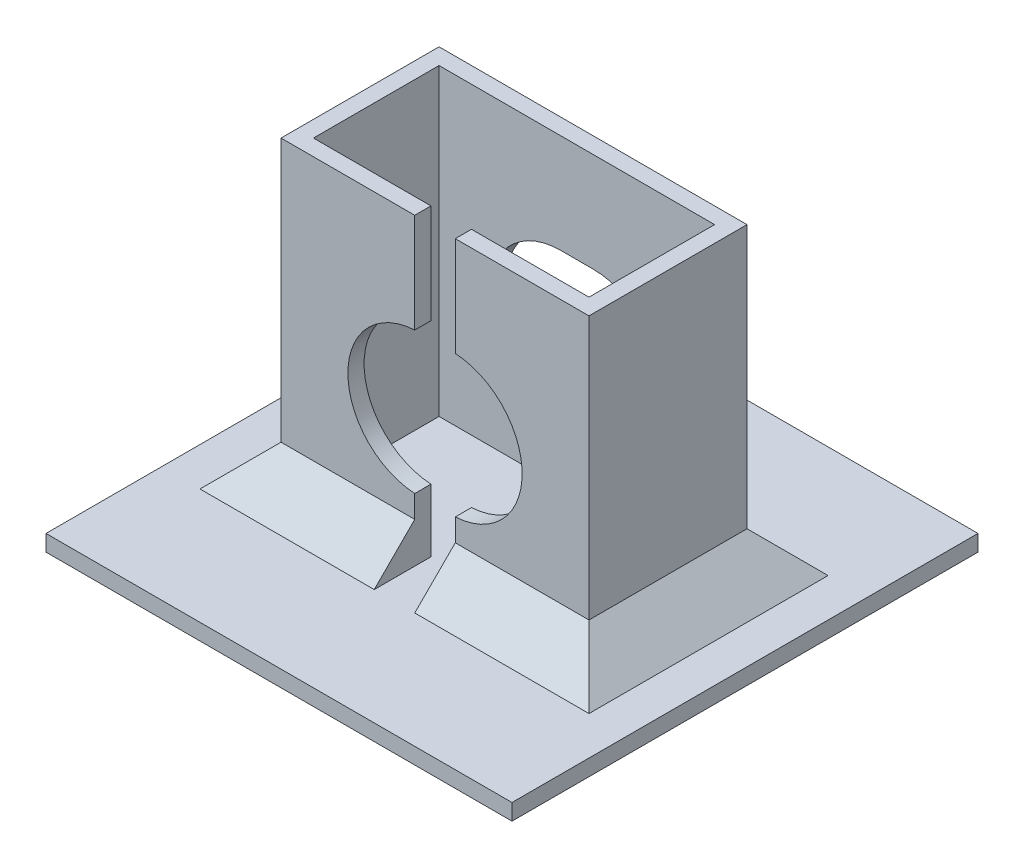
ISO-10303-21;
HEADER;
FILE_DESCRIPTION(('STEP AP214'),'2;1');
FILE_NAME('part.step','',(''),(''),'','','');
FILE_SCHEMA(('AUTOMOTIVE_DESIGN { 1 0 10303 214 1 1 1 1 }'));
ENDSEC;
DATA;
#1=APPLICATION_CONTEXT('core data for automotive mechanical design processes');
#2=APPLICATION_PROTOCOL_DEFINITION('international standard','automotive_design',2000,#1);
#3=PRODUCT_CONTEXT('',#1,'mechanical');
#4=PRODUCT('Part','Part','',(#3));
#5=PRODUCT_RELATED_PRODUCT_CATEGORY('part','',(#4));
#6=PRODUCT_DEFINITION_FORMATION('','',#4);
#7=PRODUCT_DEFINITION_CONTEXT('part definition',#1,'design');
#8=PRODUCT_DEFINITION('design','',#6,#7);
#9=PRODUCT_DEFINITION_SHAPE('','',#8);
#10=(LENGTH_UNIT() NAMED_UNIT(*) SI_UNIT(.MILLI.,.METRE.));
#11=(NAMED_UNIT(*) PLANE_ANGLE_UNIT() SI_UNIT($,.RADIAN.));
#12=(NAMED_UNIT(*) SI_UNIT($,.STERADIAN.) SOLID_ANGLE_UNIT());
#13=UNCERTAINTY_MEASURE_WITH_UNIT(LENGTH_MEASURE(1.E-05),#10,'distance_accuracy_value','');
#14=(GEOMETRIC_REPRESENTATION_CONTEXT(3) GLOBAL_UNCERTAINTY_ASSIGNED_CONTEXT((#13)) GLOBAL_UNIT_ASSIGNED_CONTEXT((#10,
#11,#12)) REPRESENTATION_CONTEXT('',''));
#15=CARTESIAN_POINT('',(0.,0.,0.));
#16=DIRECTION('',(0.,0.,1.));
#17=DIRECTION('',(1.,0.,0.));
#18=AXIS2_PLACEMENT_3D('',#15,#16,#17);
#19=CARTESIAN_POINT('',(29.,75.0000000000001,-2.));
#20=DIRECTION('',(-1.,0.,0.));
#21=DIRECTION('',(0.,-1.,0.));
#22=AXIS2_PLACEMENT_3D('',#19,#20,#21);
#23=PLANE('',#22);
#24=DIRECTION('',(0.,1.,0.));
#25=VECTOR('',#24,1.);
#26=CARTESIAN_POINT('',(29.,75.0000000000001,0.));
#27=LINE('',#26,#25);
#28=CARTESIAN_POINT('',(29.,0.,0.));
#29=VERTEX_POINT('',#28);
#30=CARTESIAN_POINT('',(29.,15.5285947903439,0.));
#31=VERTEX_POINT('',#30);
#32=EDGE_CURVE('E310',#29,#31,#27,.T.);
#33=ORIENTED_EDGE('',*,*,#32,.T.);
#34=DIRECTION('',(0.,0.,1.));
#35=VECTOR('',#34,1.);
#36=CARTESIAN_POINT('',(29.,15.5285947903439,-48.));
#37=LINE('',#36,#35);
#38=CARTESIAN_POINT('',(29.,15.5285947903439,4.));
#39=VERTEX_POINT('',#38);
#40=EDGE_CURVE('E260',#31,#39,#37,.T.);
#41=ORIENTED_EDGE('',*,*,#40,.T.);
#42=DIRECTION('',(0.,-1.,0.));
#43=VECTOR('',#42,1.);
#44=CARTESIAN_POINT('',(29.,75.0000000000001,4.));
#45=LINE('',#44,#43);
#46=CARTESIAN_POINT('',(29.,10.,4.));
#47=VERTEX_POINT('',#46);
#48=EDGE_CURVE('E273',#39,#47,#45,.T.);
#49=ORIENTED_EDGE('',*,*,#48,.T.);
#50=DIRECTION('',(0.,-0.707106781186545,0.70710678118655));
#51=VECTOR('',#50,1.);
#52=CARTESIAN_POINT('',(29.,45.4999999999998,-31.5));
#53=LINE('',#52,#51);
#54=CARTESIAN_POINT('',(29.,0.,14.0000000000001));
#55=VERTEX_POINT('',#54);
#56=EDGE_CURVE('E76',#47,#55,#53,.T.);
#57=ORIENTED_EDGE('',*,*,#56,.T.);
#58=DIRECTION('',(0.,0.,1.));
#59=VECTOR('',#58,1.);
#60=CARTESIAN_POINT('',(29.,0.,-2.));
#61=LINE('',#60,#59);
#62=EDGE_CURVE('E292',#29,#55,#61,.T.);
#63=ORIENTED_EDGE('',*,*,#62,.F.);
#64=EDGE_LOOP('',(#33,#41,#49,#57,#63));
#65=FACE_BOUND('',#64,.T.);
#66=ADVANCED_FACE('F65',(#65),#23,.F.);
#67=CARTESIAN_POINT('',(39.,75.0000000000001,-2.));
#68=DIRECTION('',(1.,0.,0.));
#69=DIRECTION('',(0.,1.,0.));
#70=AXIS2_PLACEMENT_3D('',#67,#68,#69);
#71=PLANE('',#70);
#72=DIRECTION('',(0.,-1.,0.));
#73=VECTOR('',#72,1.);
#74=CARTESIAN_POINT('',(39.,75.0000000000001,0.));
#75=LINE('',#74,#73);
#76=CARTESIAN_POINT('',(39.,75.0000000000001,0.));
#77=VERTEX_POINT('',#76);
#78=CARTESIAN_POINT('',(39.,50.4714052096561,0.));
#79=VERTEX_POINT('',#78);
#80=EDGE_CURVE('E305',#77,#79,#75,.T.);
#81=ORIENTED_EDGE('',*,*,#80,.T.);
#82=DIRECTION('',(0.,0.,1.));
#83=VECTOR('',#82,1.);
#84=CARTESIAN_POINT('',(39.,50.4714052096561,-48.));
#85=LINE('',#84,#83);
#86=CARTESIAN_POINT('',(39.,50.4714052096561,4.));
#87=VERTEX_POINT('',#86);
#88=EDGE_CURVE('E261',#79,#87,#85,.T.);
#89=ORIENTED_EDGE('',*,*,#88,.T.);
#90=DIRECTION('',(0.,1.,0.));
#91=VECTOR('',#90,1.);
#92=CARTESIAN_POINT('',(39.,75.0000000000001,4.));
#93=LINE('',#92,#91);
#94=CARTESIAN_POINT('',(39.,75.0000000000001,4.));
#95=VERTEX_POINT('',#94);
#96=EDGE_CURVE('E281',#87,#95,#93,.T.);
#97=ORIENTED_EDGE('',*,*,#96,.T.);
#98=DIRECTION('',(0.,0.,1.));
#99=VECTOR('',#98,1.);
#100=CARTESIAN_POINT('',(39.,75.0000000000001,-2.));
#101=LINE('',#100,#99);
#102=EDGE_CURVE('E296',#77,#95,#101,.T.);
#103=ORIENTED_EDGE('',*,*,#102,.F.);
#104=EDGE_LOOP('',(#81,#89,#97,#103));
#105=FACE_BOUND('',#104,.T.);
#106=ADVANCED_FACE('F579',(#105),#71,.F.);
#107=CARTESIAN_POINT('',(-3.99999999999999,75.0000000000001,4.));
#108=DIRECTION('',(0.,0.,-1.));
#109=DIRECTION('',(-1.,0.,0.));
#110=AXIS2_PLACEMENT_3D('',#107,#108,#109);
#111=PLANE('',#110);
#112=DIRECTION('',(0.,-1.,0.));
#113=VECTOR('',#112,1.);
#114=CARTESIAN_POINT('',(-3.99999999999999,75.0000000000001,4.));
#115=LINE('',#114,#113);
#116=CARTESIAN_POINT('',(-3.99999999999999,75.0000000000001,4.));
#117=VERTEX_POINT('',#116);
#118=CARTESIAN_POINT('',(-3.99999999999999,10.,4.));
#119=VERTEX_POINT('',#118);
#120=EDGE_CURVE('E420',#117,#119,#115,.T.);
#121=ORIENTED_EDGE('',*,*,#120,.T.);
#122=DIRECTION('',(1.,0.,0.));
#123=VECTOR('',#122,1.);
#124=CARTESIAN_POINT('',(-3.99999999999999,10.,4.));
#125=LINE('',#124,#123);
#126=EDGE_CURVE('E449',#119,#47,#125,.T.);
#127=ORIENTED_EDGE('',*,*,#126,.T.);
#128=ORIENTED_EDGE('',*,*,#48,.F.);
#129=CARTESIAN_POINT('',(30.,33.,4.));
#130=DIRECTION('',(0.,0.,1.));
#131=DIRECTION('',(1.,0.,0.));
#132=AXIS2_PLACEMENT_3D('',#129,#130,#131);
#133=CIRCLE('',#132,17.5);
#134=CARTESIAN_POINT('',(29.,50.4714052096561,4.));
#135=VERTEX_POINT('',#134);
#136=EDGE_CURVE('E252',#135,#39,#133,.T.);
#137=ORIENTED_EDGE('',*,*,#136,.F.);
#138=CARTESIAN_POINT('',(29.,75.0000000000001,4.));
#139=VERTEX_POINT('',#138);
#140=EDGE_CURVE('E269',#139,#135,#45,.T.);
#141=ORIENTED_EDGE('',*,*,#140,.F.);
#142=DIRECTION('',(1.,0.,0.));
#143=VECTOR('',#142,1.);
#144=CARTESIAN_POINT('',(-3.99999999999999,75.0000000000001,4.));
#145=LINE('',#144,#143);
#146=EDGE_CURVE('E416',#117,#139,#145,.T.);
#147=ORIENTED_EDGE('',*,*,#146,.F.);
#148=EDGE_LOOP('',(#121,#127,#128,#137,#141,#147));
#149=FACE_BOUND('',#148,.T.);
#150=ADVANCED_FACE('F267',(#149),#111,.F.);
#151=CARTESIAN_POINT('',(0.,75.0000000000001,0.));
#152=DIRECTION('',(0.,0.,-1.));
#153=DIRECTION('',(-1.,0.,0.));
#154=AXIS2_PLACEMENT_3D('',#151,#152,#153);
#155=PLANE('',#154);
#156=CARTESIAN_POINT('',(30.,33.,0.));
#157=DIRECTION('',(0.,0.,-1.));
#158=DIRECTION('',(-1.,0.,0.));
#159=AXIS2_PLACEMENT_3D('',#156,#157,#158);
#160=CIRCLE('',#159,17.5);
#161=CARTESIAN_POINT('',(29.,50.4714052096561,0.));
#162=VERTEX_POINT('',#161);
#163=EDGE_CURVE('E255',#31,#162,#160,.T.);
#164=ORIENTED_EDGE('',*,*,#163,.F.);
#165=ORIENTED_EDGE('',*,*,#32,.F.);
#166=DIRECTION('',(1.,0.,0.));
#167=VECTOR('',#166,1.);
#168=CARTESIAN_POINT('',(0.,0.,0.));
#169=LINE('',#168,#167);
#170=CARTESIAN_POINT('',(0.,0.,0.));
#171=VERTEX_POINT('',#170);
#172=EDGE_CURVE('E374',#171,#29,#169,.T.);
#173=ORIENTED_EDGE('',*,*,#172,.F.);
#174=DIRECTION('',(0.,-1.,0.));
#175=VECTOR('',#174,1.);
#176=CARTESIAN_POINT('',(0.,75.0000000000001,0.));
#177=LINE('',#176,#175);
#178=CARTESIAN_POINT('',(0.,75.0000000000001,0.));
#179=VERTEX_POINT('',#178);
#180=EDGE_CURVE('E373',#179,#171,#177,.T.);
#181=ORIENTED_EDGE('',*,*,#180,.F.);
#182=DIRECTION('',(1.,0.,0.));
#183=VECTOR('',#182,1.);
#184=CARTESIAN_POINT('',(0.,75.0000000000001,0.));
#185=LINE('',#184,#183);
#186=CARTESIAN_POINT('',(29.,75.0000000000001,0.));
#187=VERTEX_POINT('',#186);
#188=EDGE_CURVE('E357',#179,#187,#185,.T.);
#189=ORIENTED_EDGE('',*,*,#188,.T.);
#190=EDGE_CURVE('E309',#162,#187,#27,.T.);
#191=ORIENTED_EDGE('',*,*,#190,.F.);
#192=EDGE_LOOP('',(#164,#165,#173,#181,#189,#191));
#193=FACE_BOUND('',#192,.T.);
#194=ADVANCED_FACE('F558',(#193),#155,.T.);
#195=CARTESIAN_POINT('',(0.,75.0000000000001,0.));
#196=DIRECTION('',(0.,-1.,0.));
#197=DIRECTION('',(0.,0.,-1.));
#198=AXIS2_PLACEMENT_3D('',#195,#196,#197);
#199=PLANE('',#198);
#200=ORIENTED_EDGE('',*,*,#146,.T.);
#201=DIRECTION('',(0.,0.,1.));
#202=VECTOR('',#201,1.);
#203=CARTESIAN_POINT('',(29.,75.0000000000001,-2.));
#204=LINE('',#203,#202);
#205=EDGE_CURVE('E279',#187,#139,#204,.T.);
#206=ORIENTED_EDGE('',*,*,#205,.F.);
#207=ORIENTED_EDGE('',*,*,#188,.F.);
#208=DIRECTION('',(0.,0.,-1.));
#209=VECTOR('',#208,1.);
#210=CARTESIAN_POINT('',(0.,75.0000000000001,0.));
#211=LINE('',#210,#209);
#212=CARTESIAN_POINT('',(0.,75.0000000000001,-31.));
#213=VERTEX_POINT('',#212);
#214=EDGE_CURVE('E369',#179,#213,#211,.T.);
#215=ORIENTED_EDGE('',*,*,#214,.T.);
#216=DIRECTION('',(1.,0.,0.));
#217=VECTOR('',#216,1.);
#218=CARTESIAN_POINT('',(0.,75.0000000000001,-31.));
#219=LINE('',#218,#217);
#220=CARTESIAN_POINT('',(68.,75.0000000000001,-31.));
#221=VERTEX_POINT('',#220);
#222=EDGE_CURVE('E365',#213,#221,#219,.T.);
#223=ORIENTED_EDGE('',*,*,#222,.T.);
#224=DIRECTION('',(0.,0.,-1.));
#225=VECTOR('',#224,1.);
#226=CARTESIAN_POINT('',(68.,75.0000000000001,0.));
#227=LINE('',#226,#225);
#228=CARTESIAN_POINT('',(68.,75.0000000000001,0.));
#229=VERTEX_POINT('',#228);
#230=EDGE_CURVE('E361',#229,#221,#227,.T.);
#231=ORIENTED_EDGE('',*,*,#230,.F.);
#232=EDGE_CURVE('E362',#77,#229,#185,.T.);
#233=ORIENTED_EDGE('',*,*,#232,.F.);
#234=ORIENTED_EDGE('',*,*,#102,.T.);
#235=CARTESIAN_POINT('',(72.,75.0000000000001,4.));
#236=VERTEX_POINT('',#235);
#237=EDGE_CURVE('E415',#95,#236,#145,.T.);
#238=ORIENTED_EDGE('',*,*,#237,.T.);
#239=DIRECTION('',(0.,0.,-1.));
#240=VECTOR('',#239,1.);
#241=CARTESIAN_POINT('',(72.,75.0000000000001,4.));
#242=LINE('',#241,#240);
#243=CARTESIAN_POINT('',(72.,75.0000000000001,-35.));
#244=VERTEX_POINT('',#243);
#245=EDGE_CURVE('E412',#236,#244,#242,.T.);
#246=ORIENTED_EDGE('',*,*,#245,.T.);
#247=DIRECTION('',(1.,0.,0.));
#248=VECTOR('',#247,1.);
#249=CARTESIAN_POINT('',(-3.99999999999999,75.0000000000001,-35.));
#250=LINE('',#249,#248);
#251=CARTESIAN_POINT('',(-3.99999999999999,75.0000000000001,-35.));
#252=VERTEX_POINT('',#251);
#253=EDGE_CURVE('E408',#252,#244,#250,.T.);
#254=ORIENTED_EDGE('',*,*,#253,.F.);
#255=DIRECTION('',(0.,0.,-1.));
#256=VECTOR('',#255,1.);
#257=CARTESIAN_POINT('',(-3.99999999999999,75.0000000000001,4.));
#258=LINE('',#257,#256);
#259=EDGE_CURVE('E404',#117,#252,#258,.T.);
#260=ORIENTED_EDGE('',*,*,#259,.F.);
#261=EDGE_LOOP('',(#200,#206,#207,#215,#223,#231,#233,#234,#238,#246,#254,#260));
#262=FACE_BOUND('',#261,.T.);
#263=ADVANCED_FACE('F522',(#262),#199,.F.);
#264=CARTESIAN_POINT('',(-3.99999999999999,75.0000000000001,4.));
#265=DIRECTION('',(-1.,0.,0.));
#266=DIRECTION('',(0.,0.,1.));
#267=AXIS2_PLACEMENT_3D('',#264,#265,#266);
#268=PLANE('',#267);
#269=DIRECTION('',(0.,-1.,0.));
#270=VECTOR('',#269,1.);
#271=CARTESIAN_POINT('',(-3.99999999999999,75.0000000000001,-35.));
#272=LINE('',#271,#270);
#273=CARTESIAN_POINT('',(-3.99999999999999,10.,-35.));
#274=VERTEX_POINT('',#273);
#275=EDGE_CURVE('E419',#252,#274,#272,.T.);
#276=ORIENTED_EDGE('',*,*,#275,.T.);
#277=DIRECTION('',(0.,0.,1.));
#278=VECTOR('',#277,1.);
#279=CARTESIAN_POINT('',(-3.99999999999999,10.,4.));
#280=LINE('',#279,#278);
#281=EDGE_CURVE('E468',#274,#119,#280,.T.);
#282=ORIENTED_EDGE('',*,*,#281,.T.);
#283=ORIENTED_EDGE('',*,*,#120,.F.);
#284=ORIENTED_EDGE('',*,*,#259,.T.);
#285=EDGE_LOOP('',(#276,#282,#283,#284));
#286=FACE_BOUND('',#285,.T.);
#287=ADVANCED_FACE('F518',(#286),#268,.T.);
#288=CARTESIAN_POINT('',(39.,10.,4.));
#289=VERTEX_POINT('',#288);
#290=CARTESIAN_POINT('',(39.,15.5285947903439,4.));
#291=VERTEX_POINT('',#290);
#292=EDGE_CURVE('E285',#289,#291,#93,.T.);
#293=ORIENTED_EDGE('',*,*,#292,.F.);
#294=DIRECTION('',(1.,0.,0.));
#295=VECTOR('',#294,1.);
#296=CARTESIAN_POINT('',(-3.99999999999999,10.,4.));
#297=LINE('',#296,#295);
#298=CARTESIAN_POINT('',(72.,10.,4.));
#299=VERTEX_POINT('',#298);
#300=EDGE_CURVE('E92',#289,#299,#297,.T.);
#301=ORIENTED_EDGE('',*,*,#300,.T.);
#302=DIRECTION('',(0.,-1.,0.));
#303=VECTOR('',#302,1.);
#304=CARTESIAN_POINT('',(72.,75.0000000000001,4.));
#305=LINE('',#304,#303);
#306=EDGE_CURVE('E424',#236,#299,#305,.T.);
#307=ORIENTED_EDGE('',*,*,#306,.F.);
#308=ORIENTED_EDGE('',*,*,#237,.F.);
#309=ORIENTED_EDGE('',*,*,#96,.F.);
#310=CARTESIAN_POINT('',(38.,33.,4.));
#311=DIRECTION('',(0.,0.,1.));
#312=DIRECTION('',(1.,0.,0.));
#313=AXIS2_PLACEMENT_3D('',#310,#311,#312);
#314=CIRCLE('',#313,17.5);
#315=EDGE_CURVE('E275',#291,#87,#314,.T.);
#316=ORIENTED_EDGE('',*,*,#315,.F.);
#317=EDGE_LOOP('',(#293,#301,#307,#308,#309,#316));
#318=FACE_BOUND('',#317,.T.);
#319=ADVANCED_FACE('F528',(#318),#111,.F.);
#320=CARTESIAN_POINT('',(72.,75.0000000000001,4.));
#321=DIRECTION('',(-1.,0.,0.));
#322=DIRECTION('',(0.,0.,1.));
#323=AXIS2_PLACEMENT_3D('',#320,#321,#322);
#324=PLANE('',#323);
#325=ORIENTED_EDGE('',*,*,#306,.T.);
#326=DIRECTION('',(0.,0.,-1.));
#327=VECTOR('',#326,1.);
#328=CARTESIAN_POINT('',(72.,10.,4.));
#329=LINE('',#328,#327);
#330=CARTESIAN_POINT('',(72.,10.,-35.));
#331=VERTEX_POINT('',#330);
#332=EDGE_CURVE('E84',#299,#331,#329,.T.);
#333=ORIENTED_EDGE('',*,*,#332,.T.);
#334=DIRECTION('',(0.,-1.,0.));
#335=VECTOR('',#334,1.);
#336=CARTESIAN_POINT('',(72.,75.0000000000001,-35.));
#337=LINE('',#336,#335);
#338=EDGE_CURVE('E427',#244,#331,#337,.T.);
#339=ORIENTED_EDGE('',*,*,#338,.F.);
#340=ORIENTED_EDGE('',*,*,#245,.F.);
#341=EDGE_LOOP('',(#325,#333,#339,#340));
#342=FACE_BOUND('',#341,.T.);
#343=ADVANCED_FACE('F526',(#342),#324,.F.);
#344=CARTESIAN_POINT('',(-3.99999999999999,75.0000000000001,-35.));
#345=DIRECTION('',(0.,0.,-1.));
#346=DIRECTION('',(-1.,0.,0.));
#347=AXIS2_PLACEMENT_3D('',#344,#345,#346);
#348=PLANE('',#347);
#349=CARTESIAN_POINT('',(30.,33.,-35.));
#350=DIRECTION('',(0.,0.,-1.));
#351=DIRECTION('',(-1.,0.,0.));
#352=AXIS2_PLACEMENT_3D('',#349,#350,#351);
#353=CIRCLE('',#352,17.5);
#354=CARTESIAN_POINT('',(30.,15.5,-35.));
#355=VERTEX_POINT('',#354);
#356=CARTESIAN_POINT('',(30.,50.5,-35.));
#357=VERTEX_POINT('',#356);
#358=EDGE_CURVE('E880',#355,#357,#353,.T.);
#359=ORIENTED_EDGE('',*,*,#358,.F.);
#360=DIRECTION('',(-1.,0.,0.));
#361=VECTOR('',#360,1.);
#362=CARTESIAN_POINT('',(-3.99999999999998,15.5,-35.));
#363=LINE('',#362,#361);
#364=CARTESIAN_POINT('',(38.,15.5,-35.));
#365=VERTEX_POINT('',#364);
#366=EDGE_CURVE('E882',#365,#355,#363,.T.);
#367=ORIENTED_EDGE('',*,*,#366,.F.);
#368=CARTESIAN_POINT('',(38.,33.,-35.));
#369=DIRECTION('',(0.,0.,-1.));
#370=DIRECTION('',(-1.,0.,0.));
#371=AXIS2_PLACEMENT_3D('',#368,#369,#370);
#372=CIRCLE('',#371,17.5);
#373=CARTESIAN_POINT('',(38.,50.5,-35.));
#374=VERTEX_POINT('',#373);
#375=EDGE_CURVE('E564',#374,#365,#372,.T.);
#376=ORIENTED_EDGE('',*,*,#375,.F.);
#377=DIRECTION('',(1.,0.,0.));
#378=VECTOR('',#377,1.);
#379=CARTESIAN_POINT('',(-3.99999999999999,50.5,-35.));
#380=LINE('',#379,#378);
#381=EDGE_CURVE('E287',#357,#374,#380,.T.);
#382=ORIENTED_EDGE('',*,*,#381,.F.);
#383=EDGE_LOOP('',(#359,#367,#376,#382));
#384=FACE_BOUND('',#383,.T.);
#385=ORIENTED_EDGE('',*,*,#338,.T.);
#386=DIRECTION('',(-1.,0.,0.));
#387=VECTOR('',#386,1.);
#388=CARTESIAN_POINT('',(-3.99999999999999,10.,-35.));
#389=LINE('',#388,#387);
#390=EDGE_CURVE('E475',#331,#274,#389,.T.);
#391=ORIENTED_EDGE('',*,*,#390,.T.);
#392=ORIENTED_EDGE('',*,*,#275,.F.);
#393=ORIENTED_EDGE('',*,*,#253,.T.);
#394=EDGE_LOOP('',(#385,#391,#392,#393));
#395=FACE_BOUND('',#394,.T.);
#396=ADVANCED_FACE('F525',(#384,#395),#348,.T.);
#397=CARTESIAN_POINT('',(38.,33.,0.));
#398=DIRECTION('',(0.,0.,-1.));
#399=DIRECTION('',(-1.,0.,0.));
#400=AXIS2_PLACEMENT_3D('',#397,#398,#399);
#401=CIRCLE('',#400,17.5);
#402=CARTESIAN_POINT('',(39.,15.5285947903439,0.));
#403=VERTEX_POINT('',#402);
#404=EDGE_CURVE('E544',#79,#403,#401,.T.);
#405=ORIENTED_EDGE('',*,*,#404,.F.);
#406=ORIENTED_EDGE('',*,*,#80,.F.);
#407=ORIENTED_EDGE('',*,*,#232,.T.);
#408=DIRECTION('',(0.,-1.,0.));
#409=VECTOR('',#408,1.);
#410=CARTESIAN_POINT('',(68.,75.0000000000001,0.));
#411=LINE('',#410,#409);
#412=CARTESIAN_POINT('',(68.,0.,0.));
#413=VERTEX_POINT('',#412);
#414=EDGE_CURVE('E400',#229,#413,#411,.T.);
#415=ORIENTED_EDGE('',*,*,#414,.T.);
#416=CARTESIAN_POINT('',(39.,0.,0.));
#417=VERTEX_POINT('',#416);
#418=EDGE_CURVE('E347',#417,#413,#169,.T.);
#419=ORIENTED_EDGE('',*,*,#418,.F.);
#420=EDGE_CURVE('E295',#403,#417,#75,.T.);
#421=ORIENTED_EDGE('',*,*,#420,.F.);
#422=EDGE_LOOP('',(#405,#406,#407,#415,#419,#421));
#423=FACE_BOUND('',#422,.T.);
#424=ADVANCED_FACE('F542',(#423),#155,.T.);
#425=CARTESIAN_POINT('',(68.,75.0000000000001,0.));
#426=DIRECTION('',(-1.,0.,0.));
#427=DIRECTION('',(0.,0.,1.));
#428=AXIS2_PLACEMENT_3D('',#425,#426,#427);
#429=PLANE('',#428);
#430=DIRECTION('',(0.,0.,-1.));
#431=VECTOR('',#430,1.);
#432=CARTESIAN_POINT('',(68.,0.,0.));
#433=LINE('',#432,#431);
#434=CARTESIAN_POINT('',(68.,0.,-31.));
#435=VERTEX_POINT('',#434);
#436=EDGE_CURVE('E378',#413,#435,#433,.T.);
#437=ORIENTED_EDGE('',*,*,#436,.F.);
#438=ORIENTED_EDGE('',*,*,#414,.F.);
#439=ORIENTED_EDGE('',*,*,#230,.T.);
#440=DIRECTION('',(0.,-1.,0.));
#441=VECTOR('',#440,1.);
#442=CARTESIAN_POINT('',(68.,75.0000000000001,-31.));
#443=LINE('',#442,#441);
#444=EDGE_CURVE('E396',#221,#435,#443,.T.);
#445=ORIENTED_EDGE('',*,*,#444,.T.);
#446=EDGE_LOOP('',(#437,#438,#439,#445));
#447=FACE_BOUND('',#446,.T.);
#448=ADVANCED_FACE('F548',(#447),#429,.T.);
#449=CARTESIAN_POINT('',(0.,75.0000000000001,-31.));
#450=DIRECTION('',(0.,0.,-1.));
#451=DIRECTION('',(-1.,0.,0.));
#452=AXIS2_PLACEMENT_3D('',#449,#450,#451);
#453=PLANE('',#452);
#454=DIRECTION('',(-1.,0.,0.));
#455=VECTOR('',#454,1.);
#456=CARTESIAN_POINT('',(0.,15.5,-31.));
#457=LINE('',#456,#455);
#458=CARTESIAN_POINT('',(38.,15.5,-31.));
#459=VERTEX_POINT('',#458);
#460=CARTESIAN_POINT('',(30.,15.5,-31.));
#461=VERTEX_POINT('',#460);
#462=EDGE_CURVE('E441',#459,#461,#457,.T.);
#463=ORIENTED_EDGE('',*,*,#462,.T.);
#464=CARTESIAN_POINT('',(30.,33.,-31.));
#465=DIRECTION('',(0.,0.,-1.));
#466=DIRECTION('',(-1.,0.,0.));
#467=AXIS2_PLACEMENT_3D('',#464,#465,#466);
#468=CIRCLE('',#467,17.5);
#469=CARTESIAN_POINT('',(30.,50.5,-31.));
#470=VERTEX_POINT('',#469);
#471=EDGE_CURVE('E563',#461,#470,#468,.T.);
#472=ORIENTED_EDGE('',*,*,#471,.T.);
#473=DIRECTION('',(1.,0.,0.));
#474=VECTOR('',#473,1.);
#475=CARTESIAN_POINT('',(0.,50.5,-31.));
#476=LINE('',#475,#474);
#477=CARTESIAN_POINT('',(38.,50.5,-31.));
#478=VERTEX_POINT('',#477);
#479=EDGE_CURVE('E445',#470,#478,#476,.T.);
#480=ORIENTED_EDGE('',*,*,#479,.T.);
#481=CARTESIAN_POINT('',(38.,33.,-31.));
#482=DIRECTION('',(0.,0.,-1.));
#483=DIRECTION('',(-1.,0.,0.));
#484=AXIS2_PLACEMENT_3D('',#481,#482,#483);
#485=CIRCLE('',#484,17.5);
#486=EDGE_CURVE('E860',#478,#459,#485,.T.);
#487=ORIENTED_EDGE('',*,*,#486,.T.);
#488=EDGE_LOOP('',(#463,#472,#480,#487));
#489=FACE_BOUND('',#488,.T.);
#490=DIRECTION('',(1.,0.,0.));
#491=VECTOR('',#490,1.);
#492=CARTESIAN_POINT('',(0.,0.,-31.));
#493=LINE('',#492,#491);
#494=CARTESIAN_POINT('',(0.,0.,-31.));
#495=VERTEX_POINT('',#494);
#496=EDGE_CURVE('E381',#495,#435,#493,.T.);
#497=ORIENTED_EDGE('',*,*,#496,.T.);
#498=ORIENTED_EDGE('',*,*,#444,.F.);
#499=ORIENTED_EDGE('',*,*,#222,.F.);
#500=DIRECTION('',(0.,-1.,0.));
#501=VECTOR('',#500,1.);
#502=CARTESIAN_POINT('',(0.,75.0000000000001,-31.));
#503=LINE('',#502,#501);
#504=EDGE_CURVE('E392',#213,#495,#503,.T.);
#505=ORIENTED_EDGE('',*,*,#504,.T.);
#506=EDGE_LOOP('',(#497,#498,#499,#505));
#507=FACE_BOUND('',#506,.T.);
#508=ADVANCED_FACE('F552',(#489,#507),#453,.F.);
#509=CARTESIAN_POINT('',(0.,75.0000000000001,0.));
#510=DIRECTION('',(-1.,0.,0.));
#511=DIRECTION('',(0.,0.,1.));
#512=AXIS2_PLACEMENT_3D('',#509,#510,#511);
#513=PLANE('',#512);
#514=DIRECTION('',(0.,0.,-1.));
#515=VECTOR('',#514,1.);
#516=CARTESIAN_POINT('',(0.,0.,0.));
#517=LINE('',#516,#515);
#518=EDGE_CURVE('E385',#171,#495,#517,.T.);
#519=ORIENTED_EDGE('',*,*,#518,.T.);
#520=ORIENTED_EDGE('',*,*,#504,.F.);
#521=ORIENTED_EDGE('',*,*,#214,.F.);
#522=ORIENTED_EDGE('',*,*,#180,.T.);
#523=EDGE_LOOP('',(#519,#520,#521,#522));
#524=FACE_BOUND('',#523,.T.);
#525=ADVANCED_FACE('F560',(#524),#513,.F.);
#526=CARTESIAN_POINT('',(0.,0.,0.));
#527=DIRECTION('',(0.,1.,0.));
#528=DIRECTION('',(0.,0.,1.));
#529=AXIS2_PLACEMENT_3D('',#526,#527,#528);
#530=PLANE('',#529);
#531=DIRECTION('',(-1.,0.,0.));
#532=VECTOR('',#531,1.);
#533=CARTESIAN_POINT('',(0.,0.,14.0000000000001));
#534=LINE('',#533,#532);
#535=CARTESIAN_POINT('',(82.0000000000001,0.,14.0000000000001));
#536=VERTEX_POINT('',#535);
#537=CARTESIAN_POINT('',(39.,0.,14.0000000000001));
#538=VERTEX_POINT('',#537);
#539=EDGE_CURVE('E458',#536,#538,#534,.T.);
#540=ORIENTED_EDGE('',*,*,#539,.T.);
#541=DIRECTION('',(0.,0.,1.));
#542=VECTOR('',#541,1.);
#543=CARTESIAN_POINT('',(39.,0.,-2.));
#544=LINE('',#543,#542);
#545=EDGE_CURVE('E300',#417,#538,#544,.T.);
#546=ORIENTED_EDGE('',*,*,#545,.F.);
#547=ORIENTED_EDGE('',*,*,#418,.T.);
#548=ORIENTED_EDGE('',*,*,#436,.T.);
#549=ORIENTED_EDGE('',*,*,#496,.F.);
#550=ORIENTED_EDGE('',*,*,#518,.F.);
#551=ORIENTED_EDGE('',*,*,#172,.T.);
#552=ORIENTED_EDGE('',*,*,#62,.T.);
#553=DIRECTION('',(-1.,0.,0.));
#554=VECTOR('',#553,1.);
#555=CARTESIAN_POINT('',(0.,0.,14.0000000000001));
#556=LINE('',#555,#554);
#557=CARTESIAN_POINT('',(-14.0000000000001,0.,14.0000000000001));
#558=VERTEX_POINT('',#557);
#559=EDGE_CURVE('E465',#55,#558,#556,.T.);
#560=ORIENTED_EDGE('',*,*,#559,.T.);
#561=DIRECTION('',(0.,0.,-1.));
#562=VECTOR('',#561,1.);
#563=CARTESIAN_POINT('',(-14.0000000000001,0.,-35.));
#564=LINE('',#563,#562);
#565=CARTESIAN_POINT('',(-14.0000000000001,0.,-45.0000000000001));
#566=VERTEX_POINT('',#565);
#567=EDGE_CURVE('E462',#558,#566,#564,.T.);
#568=ORIENTED_EDGE('',*,*,#567,.T.);
#569=DIRECTION('',(1.,0.,0.));
#570=VECTOR('',#569,1.);
#571=CARTESIAN_POINT('',(72.,0.,-45.0000000000001));
#572=LINE('',#571,#570);
#573=CARTESIAN_POINT('',(82.0000000000001,0.,-45.0000000000001));
#574=VERTEX_POINT('',#573);
#575=EDGE_CURVE('E452',#566,#574,#572,.T.);
#576=ORIENTED_EDGE('',*,*,#575,.T.);
#577=DIRECTION('',(0.,0.,1.));
#578=VECTOR('',#577,1.);
#579=CARTESIAN_POINT('',(82.0000000000001,0.,0.));
#580=LINE('',#579,#578);
#581=EDGE_CURVE('E455',#574,#536,#580,.T.);
#582=ORIENTED_EDGE('',*,*,#581,.T.);
#583=EDGE_LOOP('',(#540,#546,#547,#548,#549,#550,#551,#552,#560,#568,#576,#582));
#584=FACE_BOUND('',#583,.T.);
#585=DIRECTION('',(0.,0.,1.));
#586=VECTOR('',#585,1.);
#587=CARTESIAN_POINT('',(91.5,0.,0.));
#588=LINE('',#587,#586);
#589=CARTESIAN_POINT('',(91.5,0.,-72.5));
#590=VERTEX_POINT('',#589);
#591=CARTESIAN_POINT('',(91.5,0.,42.5));
#592=VERTEX_POINT('',#591);
#593=EDGE_CURVE('E314',#590,#592,#588,.T.);
#594=ORIENTED_EDGE('',*,*,#593,.F.);
#595=DIRECTION('',(1.,0.,0.));
#596=VECTOR('',#595,1.);
#597=CARTESIAN_POINT('',(0.,0.,-72.5));
#598=LINE('',#597,#596);
#599=CARTESIAN_POINT('',(-23.5,0.,-72.5));
#600=VERTEX_POINT('',#599);
#601=EDGE_CURVE('E334',#600,#590,#598,.T.);
#602=ORIENTED_EDGE('',*,*,#601,.F.);
#603=DIRECTION('',(0.,0.,1.));
#604=VECTOR('',#603,1.);
#605=CARTESIAN_POINT('',(-23.5,0.,0.));
#606=LINE('',#605,#604);
#607=CARTESIAN_POINT('',(-23.5,0.,42.5));
#608=VERTEX_POINT('',#607);
#609=EDGE_CURVE('E337',#600,#608,#606,.T.);
#610=ORIENTED_EDGE('',*,*,#609,.T.);
#611=DIRECTION('',(1.,0.,0.));
#612=VECTOR('',#611,1.);
#613=CARTESIAN_POINT('',(0.,0.,42.5));
#614=LINE('',#613,#612);
#615=EDGE_CURVE('E319',#608,#592,#614,.T.);
#616=ORIENTED_EDGE('',*,*,#615,.T.);
#617=EDGE_LOOP('',(#594,#602,#610,#616));
#618=FACE_BOUND('',#617,.T.);
#619=ADVANCED_FACE('F506',(#584,#618),#530,.T.);
#620=CARTESIAN_POINT('',(91.5,-4.,0.));
#621=DIRECTION('',(-1.,0.,0.));
#622=DIRECTION('',(0.,0.,1.));
#623=AXIS2_PLACEMENT_3D('',#620,#621,#622);
#624=PLANE('',#623);
#625=ORIENTED_EDGE('',*,*,#593,.T.);
#626=DIRECTION('',(0.,1.,0.));
#627=VECTOR('',#626,1.);
#628=CARTESIAN_POINT('',(91.5,-4.,42.5));
#629=LINE('',#628,#627);
#630=CARTESIAN_POINT('',(91.5,-4.,42.5));
#631=VERTEX_POINT('',#630);
#632=EDGE_CURVE('E344',#631,#592,#629,.T.);
#633=ORIENTED_EDGE('',*,*,#632,.F.);
#634=DIRECTION('',(0.,0.,1.));
#635=VECTOR('',#634,1.);
#636=CARTESIAN_POINT('',(91.5,-4.,0.));
#637=LINE('',#636,#635);
#638=CARTESIAN_POINT('',(91.5,-4.,-72.5));
#639=VERTEX_POINT('',#638);
#640=EDGE_CURVE('E315',#639,#631,#637,.T.);
#641=ORIENTED_EDGE('',*,*,#640,.F.);
#642=DIRECTION('',(0.,1.,0.));
#643=VECTOR('',#642,1.);
#644=CARTESIAN_POINT('',(91.5,-4.,-72.5));
#645=LINE('',#644,#643);
#646=EDGE_CURVE('E330',#639,#590,#645,.T.);
#647=ORIENTED_EDGE('',*,*,#646,.T.);
#648=EDGE_LOOP('',(#625,#633,#641,#647));
#649=FACE_BOUND('',#648,.T.);
#650=ADVANCED_FACE('F605',(#649),#624,.F.);
#651=CARTESIAN_POINT('',(0.,-4.,42.5));
#652=DIRECTION('',(0.,0.,1.));
#653=DIRECTION('',(1.,0.,0.));
#654=AXIS2_PLACEMENT_3D('',#651,#652,#653);
#655=PLANE('',#654);
#656=ORIENTED_EDGE('',*,*,#615,.F.);
#657=DIRECTION('',(0.,1.,0.));
#658=VECTOR('',#657,1.);
#659=CARTESIAN_POINT('',(-23.5,-4.,42.5));
#660=LINE('',#659,#658);
#661=CARTESIAN_POINT('',(-23.5,-4.,42.5));
#662=VERTEX_POINT('',#661);
#663=EDGE_CURVE('E348',#662,#608,#660,.T.);
#664=ORIENTED_EDGE('',*,*,#663,.F.);
#665=DIRECTION('',(1.,0.,0.));
#666=VECTOR('',#665,1.);
#667=CARTESIAN_POINT('',(0.,-4.,42.5));
#668=LINE('',#667,#666);
#669=EDGE_CURVE('E326',#662,#631,#668,.T.);
#670=ORIENTED_EDGE('',*,*,#669,.T.);
#671=ORIENTED_EDGE('',*,*,#632,.T.);
#672=EDGE_LOOP('',(#656,#664,#670,#671));
#673=FACE_BOUND('',#672,.T.);
#674=ADVANCED_FACE('F606',(#673),#655,.T.);
#675=CARTESIAN_POINT('',(-23.5,-4.,0.));
#676=DIRECTION('',(-1.,0.,0.));
#677=DIRECTION('',(0.,0.,1.));
#678=AXIS2_PLACEMENT_3D('',#675,#676,#677);
#679=PLANE('',#678);
#680=ORIENTED_EDGE('',*,*,#609,.F.);
#681=DIRECTION('',(0.,1.,0.));
#682=VECTOR('',#681,1.);
#683=CARTESIAN_POINT('',(-23.5,-4.,-72.5));
#684=LINE('',#683,#682);
#685=CARTESIAN_POINT('',(-23.5,-4.,-72.5));
#686=VERTEX_POINT('',#685);
#687=EDGE_CURVE('E351',#686,#600,#684,.T.);
#688=ORIENTED_EDGE('',*,*,#687,.F.);
#689=DIRECTION('',(0.,0.,1.));
#690=VECTOR('',#689,1.);
#691=CARTESIAN_POINT('',(-23.5,-4.,0.));
#692=LINE('',#691,#690);
#693=EDGE_CURVE('E322',#686,#662,#692,.T.);
#694=ORIENTED_EDGE('',*,*,#693,.T.);
#695=ORIENTED_EDGE('',*,*,#663,.T.);
#696=EDGE_LOOP('',(#680,#688,#694,#695));
#697=FACE_BOUND('',#696,.T.);
#698=ADVANCED_FACE('F599',(#697),#679,.T.);
#699=CARTESIAN_POINT('',(0.,-4.,-72.5));
#700=DIRECTION('',(0.,0.,1.));
#701=DIRECTION('',(1.,0.,0.));
#702=AXIS2_PLACEMENT_3D('',#699,#700,#701);
#703=PLANE('',#702);
#704=ORIENTED_EDGE('',*,*,#601,.T.);
#705=ORIENTED_EDGE('',*,*,#646,.F.);
#706=DIRECTION('',(1.,0.,0.));
#707=VECTOR('',#706,1.);
#708=CARTESIAN_POINT('',(0.,-4.,-72.5));
#709=LINE('',#708,#707);
#710=EDGE_CURVE('E318',#686,#639,#709,.T.);
#711=ORIENTED_EDGE('',*,*,#710,.F.);
#712=ORIENTED_EDGE('',*,*,#687,.T.);
#713=EDGE_LOOP('',(#704,#705,#711,#712));
#714=FACE_BOUND('',#713,.T.);
#715=ADVANCED_FACE('F594',(#714),#703,.F.);
#716=CARTESIAN_POINT('',(0.,-4.,0.));
#717=DIRECTION('',(0.,1.,0.));
#718=DIRECTION('',(0.,0.,1.));
#719=AXIS2_PLACEMENT_3D('',#716,#717,#718);
#720=PLANE('',#719);
#721=ORIENTED_EDGE('',*,*,#640,.T.);
#722=ORIENTED_EDGE('',*,*,#669,.F.);
#723=ORIENTED_EDGE('',*,*,#693,.F.);
#724=ORIENTED_EDGE('',*,*,#710,.T.);
#725=EDGE_LOOP('',(#721,#722,#723,#724));
#726=FACE_BOUND('',#725,.T.);
#727=ADVANCED_FACE('F588',(#726),#720,.F.);
#728=ORIENTED_EDGE('',*,*,#140,.T.);
#729=DIRECTION('',(0.,0.,1.));
#730=VECTOR('',#729,1.);
#731=CARTESIAN_POINT('',(29.,50.4714052096561,-48.));
#732=LINE('',#731,#730);
#733=EDGE_CURVE('E249',#135,#162,#732,.F.);
#734=ORIENTED_EDGE('',*,*,#733,.T.);
#735=ORIENTED_EDGE('',*,*,#190,.T.);
#736=ORIENTED_EDGE('',*,*,#205,.T.);
#737=EDGE_LOOP('',(#728,#734,#735,#736));
#738=FACE_BOUND('',#737,.T.);
#739=ADVANCED_FACE('F277',(#738),#23,.F.);
#740=ORIENTED_EDGE('',*,*,#545,.T.);
#741=DIRECTION('',(0.,0.707106781186545,-0.70710678118655));
#742=VECTOR('',#741,1.);
#743=CARTESIAN_POINT('',(39.,45.4999999999998,-31.5));
#744=LINE('',#743,#742);
#745=EDGE_CURVE('E12',#538,#289,#744,.T.);
#746=ORIENTED_EDGE('',*,*,#745,.T.);
#747=ORIENTED_EDGE('',*,*,#292,.T.);
#748=DIRECTION('',(0.,0.,1.));
#749=VECTOR('',#748,1.);
#750=CARTESIAN_POINT('',(39.,15.5285947903439,-48.));
#751=LINE('',#750,#749);
#752=EDGE_CURVE('E423',#291,#403,#751,.F.);
#753=ORIENTED_EDGE('',*,*,#752,.T.);
#754=ORIENTED_EDGE('',*,*,#420,.T.);
#755=EDGE_LOOP('',(#740,#746,#747,#753,#754));
#756=FACE_BOUND('',#755,.T.);
#757=ADVANCED_FACE('F538',(#756),#71,.F.);
#758=CARTESIAN_POINT('',(38.,33.,-48.));
#759=DIRECTION('',(0.,0.,1.));
#760=DIRECTION('',(1.,0.,0.));
#761=AXIS2_PLACEMENT_3D('',#758,#759,#760);
#762=CYLINDRICAL_SURFACE('',#761,17.5);
#763=ORIENTED_EDGE('',*,*,#404,.T.);
#764=ORIENTED_EDGE('',*,*,#752,.F.);
#765=ORIENTED_EDGE('',*,*,#315,.T.);
#766=ORIENTED_EDGE('',*,*,#88,.F.);
#767=EDGE_LOOP('',(#763,#764,#765,#766));
#768=FACE_BOUND('',#767,.T.);
#769=ADVANCED_FACE('F593',(#768),#762,.F.);
#770=CARTESIAN_POINT('',(30.,33.,-48.));
#771=DIRECTION('',(0.,0.,1.));
#772=DIRECTION('',(1.,0.,0.));
#773=AXIS2_PLACEMENT_3D('',#770,#771,#772);
#774=CYLINDRICAL_SURFACE('',#773,17.5);
#775=ORIENTED_EDGE('',*,*,#163,.T.);
#776=ORIENTED_EDGE('',*,*,#733,.F.);
#777=ORIENTED_EDGE('',*,*,#136,.T.);
#778=ORIENTED_EDGE('',*,*,#40,.F.);
#779=EDGE_LOOP('',(#775,#776,#777,#778));
#780=FACE_BOUND('',#779,.T.);
#781=ADVANCED_FACE('F251',(#780),#774,.F.);
#782=CARTESIAN_POINT('',(30.,50.5,-48.));
#783=DIRECTION('',(0.,1.,0.));
#784=DIRECTION('',(0.,0.,1.));
#785=AXIS2_PLACEMENT_3D('',#782,#783,#784);
#786=PLANE('',#785);
#787=ORIENTED_EDGE('',*,*,#381,.T.);
#788=DIRECTION('',(0.,0.,1.));
#789=VECTOR('',#788,1.);
#790=CARTESIAN_POINT('',(38.,50.5,-48.));
#791=LINE('',#790,#789);
#792=EDGE_CURVE('E868',#374,#478,#791,.T.);
#793=ORIENTED_EDGE('',*,*,#792,.T.);
#794=ORIENTED_EDGE('',*,*,#479,.F.);
#795=DIRECTION('',(0.,0.,1.));
#796=VECTOR('',#795,1.);
#797=CARTESIAN_POINT('',(30.,50.5,-48.));
#798=LINE('',#797,#796);
#799=EDGE_CURVE('E861',#357,#470,#798,.T.);
#800=ORIENTED_EDGE('',*,*,#799,.F.);
#801=EDGE_LOOP('',(#787,#793,#794,#800));
#802=FACE_BOUND('',#801,.T.);
#803=ADVANCED_FACE('F753',(#802),#786,.F.);
#804=CARTESIAN_POINT('',(30.,15.5,-48.));
#805=DIRECTION('',(0.,-1.,0.));
#806=DIRECTION('',(1.,0.,0.));
#807=AXIS2_PLACEMENT_3D('',#804,#805,#806);
#808=PLANE('',#807);
#809=ORIENTED_EDGE('',*,*,#366,.T.);
#810=DIRECTION('',(0.,0.,1.));
#811=VECTOR('',#810,1.);
#812=CARTESIAN_POINT('',(30.,15.5,-48.));
#813=LINE('',#812,#811);
#814=EDGE_CURVE('E871',#355,#461,#813,.T.);
#815=ORIENTED_EDGE('',*,*,#814,.T.);
#816=ORIENTED_EDGE('',*,*,#462,.F.);
#817=DIRECTION('',(0.,0.,1.));
#818=VECTOR('',#817,1.);
#819=CARTESIAN_POINT('',(38.,15.5,-48.));
#820=LINE('',#819,#818);
#821=EDGE_CURVE('E895',#365,#459,#820,.T.);
#822=ORIENTED_EDGE('',*,*,#821,.F.);
#823=EDGE_LOOP('',(#809,#815,#816,#822));
#824=FACE_BOUND('',#823,.T.);
#825=ADVANCED_FACE('F743',(#824),#808,.F.);
#826=ORIENTED_EDGE('',*,*,#358,.T.);
#827=ORIENTED_EDGE('',*,*,#799,.T.);
#828=ORIENTED_EDGE('',*,*,#471,.F.);
#829=ORIENTED_EDGE('',*,*,#814,.F.);
#830=EDGE_LOOP('',(#826,#827,#828,#829));
#831=FACE_BOUND('',#830,.T.);
#832=ADVANCED_FACE('F731',(#831),#774,.F.);
#833=ORIENTED_EDGE('',*,*,#375,.T.);
#834=ORIENTED_EDGE('',*,*,#821,.T.);
#835=ORIENTED_EDGE('',*,*,#486,.F.);
#836=ORIENTED_EDGE('',*,*,#792,.F.);
#837=EDGE_LOOP('',(#833,#834,#835,#836));
#838=FACE_BOUND('',#837,.T.);
#839=ADVANCED_FACE('F726',(#838),#762,.F.);
#840=CARTESIAN_POINT('',(-3.99999999999999,10.,4.));
#841=DIRECTION('',(0.,-0.70710678118655,-0.707106781186544));
#842=DIRECTION('',(1.,0.,0.));
#843=AXIS2_PLACEMENT_3D('',#840,#841,#842);
#844=PLANE('',#843);
#845=ORIENTED_EDGE('',*,*,#745,.F.);
#846=ORIENTED_EDGE('',*,*,#539,.F.);
#847=DIRECTION('',(0.577350269189627,-0.577350269189623,0.577350269189627));
#848=VECTOR('',#847,1.);
#849=CARTESIAN_POINT('',(72.,10.,4.));
#850=LINE('',#849,#848);
#851=EDGE_CURVE('E70',#299,#536,#850,.T.);
#852=ORIENTED_EDGE('',*,*,#851,.F.);
#853=ORIENTED_EDGE('',*,*,#300,.F.);
#854=EDGE_LOOP('',(#845,#846,#852,#853));
#855=FACE_BOUND('',#854,.T.);
#856=ADVANCED_FACE('F68',(#855),#844,.F.);
#857=CARTESIAN_POINT('',(72.,10.,4.));
#858=DIRECTION('',(-0.707106781186544,-0.70710678118655,0.));
#859=DIRECTION('',(0.,0.,-1.));
#860=AXIS2_PLACEMENT_3D('',#857,#858,#859);
#861=PLANE('',#860);
#862=ORIENTED_EDGE('',*,*,#851,.T.);
#863=ORIENTED_EDGE('',*,*,#581,.F.);
#864=DIRECTION('',(-0.577350269189627,0.577350269189623,0.577350269189627));
#865=VECTOR('',#864,1.);
#866=CARTESIAN_POINT('',(54.6666666666666,27.3333333333333,-17.6666666666666));
#867=LINE('',#866,#865);
#868=EDGE_CURVE('E488',#331,#574,#867,.F.);
#869=ORIENTED_EDGE('',*,*,#868,.F.);
#870=ORIENTED_EDGE('',*,*,#332,.F.);
#871=EDGE_LOOP('',(#862,#863,#869,#870));
#872=FACE_BOUND('',#871,.T.);
#873=ADVANCED_FACE('F500',(#872),#861,.F.);
#874=CARTESIAN_POINT('',(0.,0.,-45.0000000000001));
#875=DIRECTION('',(0.,0.70710678118655,-0.707106781186544));
#876=DIRECTION('',(-1.,0.,0.));
#877=AXIS2_PLACEMENT_3D('',#874,#875,#876);
#878=PLANE('',#877);
#879=ORIENTED_EDGE('',*,*,#868,.T.);
#880=ORIENTED_EDGE('',*,*,#575,.F.);
#881=DIRECTION('',(0.577350269189627,0.577350269189623,0.577350269189627));
#882=VECTOR('',#881,1.);
#883=CARTESIAN_POINT('',(-9.33333333333336,4.66666666666668,-40.3333333333334));
#884=LINE('',#883,#882);
#885=EDGE_CURVE('E485',#274,#566,#884,.F.);
#886=ORIENTED_EDGE('',*,*,#885,.F.);
#887=ORIENTED_EDGE('',*,*,#390,.F.);
#888=EDGE_LOOP('',(#879,#880,#886,#887));
#889=FACE_BOUND('',#888,.T.);
#890=ADVANCED_FACE('F511',(#889),#878,.T.);
#891=CARTESIAN_POINT('',(-14.0000000000001,0.,0.));
#892=DIRECTION('',(-0.707106781186544,0.70710678118655,0.));
#893=DIRECTION('',(0.,0.,1.));
#894=AXIS2_PLACEMENT_3D('',#891,#892,#893);
#895=PLANE('',#894);
#896=ORIENTED_EDGE('',*,*,#885,.T.);
#897=ORIENTED_EDGE('',*,*,#567,.F.);
#898=DIRECTION('',(-0.577350269189627,-0.577350269189623,0.577350269189627));
#899=VECTOR('',#898,1.);
#900=CARTESIAN_POINT('',(-9.33333333333336,4.66666666666668,9.33333333333337));
#901=LINE('',#900,#899);
#902=EDGE_CURVE('E481',#119,#558,#901,.T.);
#903=ORIENTED_EDGE('',*,*,#902,.F.);
#904=ORIENTED_EDGE('',*,*,#281,.F.);
#905=EDGE_LOOP('',(#896,#897,#903,#904));
#906=FACE_BOUND('',#905,.T.);
#907=ADVANCED_FACE('F514',(#906),#895,.T.);
#908=CARTESIAN_POINT('',(-3.99999999999999,10.,4.));
#909=DIRECTION('',(0.,-0.70710678118655,-0.707106781186544));
#910=DIRECTION('',(1.,0.,0.));
#911=AXIS2_PLACEMENT_3D('',#908,#909,#910);
#912=PLANE('',#911);
#913=ORIENTED_EDGE('',*,*,#902,.T.);
#914=ORIENTED_EDGE('',*,*,#559,.F.);
#915=ORIENTED_EDGE('',*,*,#56,.F.);
#916=ORIENTED_EDGE('',*,*,#126,.F.);
#917=EDGE_LOOP('',(#913,#914,#915,#916));
#918=FACE_BOUND('',#917,.T.);
#919=ADVANCED_FACE('F569',(#918),#912,.F.);
#920=CLOSED_SHELL('',(#66,#106,#150,#194,#263,#287,#319,#343,#396,#424,#448,#508,#525,#619,#650,
#674,#698,#715,#727,#739,#757,#769,#781,#803,#825,#832,#839,#856,#873,#890,#907,#919));
#921=MANIFOLD_SOLID_BREP('B2',#920);
#922=ADVANCED_BREP_SHAPE_REPRESENTATION('',(#18,#921),#14);
#923=SHAPE_DEFINITION_REPRESENTATION(#9,#922);
ENDSEC;
END-ISO-10303-21;
